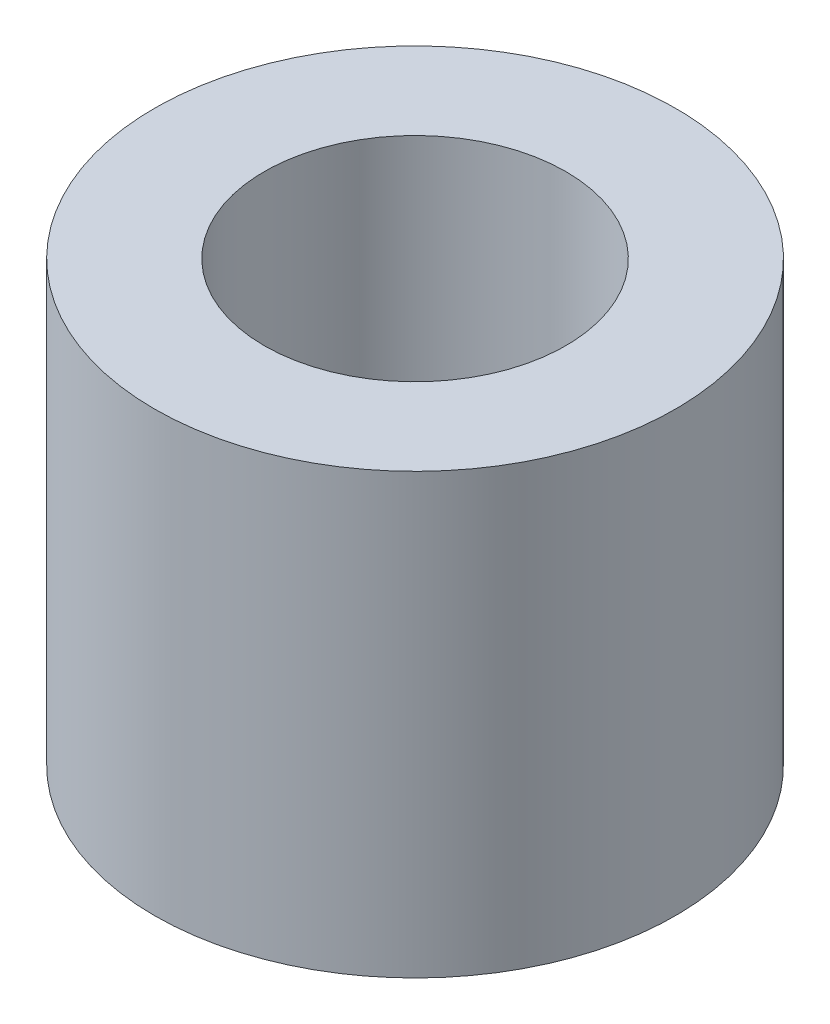
ISO-10303-21;
HEADER;
FILE_DESCRIPTION(('STEP AP214'),'2;1');
FILE_NAME('part.step','',(''),(''),'','','');
FILE_SCHEMA(('AUTOMOTIVE_DESIGN { 1 0 10303 214 1 1 1 1 }'));
ENDSEC;
DATA;
#1=APPLICATION_CONTEXT('core data for automotive mechanical design processes');
#2=APPLICATION_PROTOCOL_DEFINITION('international standard','automotive_design',2000,#1);
#3=PRODUCT_CONTEXT('',#1,'mechanical');
#4=PRODUCT('Part','Part','',(#3));
#5=PRODUCT_RELATED_PRODUCT_CATEGORY('part','',(#4));
#6=PRODUCT_DEFINITION_FORMATION('','',#4);
#7=PRODUCT_DEFINITION_CONTEXT('part definition',#1,'design');
#8=PRODUCT_DEFINITION('design','',#6,#7);
#9=PRODUCT_DEFINITION_SHAPE('','',#8);
#10=(LENGTH_UNIT() NAMED_UNIT(*) SI_UNIT(.MILLI.,.METRE.));
#11=(NAMED_UNIT(*) PLANE_ANGLE_UNIT() SI_UNIT($,.RADIAN.));
#12=(NAMED_UNIT(*) SI_UNIT($,.STERADIAN.) SOLID_ANGLE_UNIT());
#13=UNCERTAINTY_MEASURE_WITH_UNIT(LENGTH_MEASURE(1.E-05),#10,'distance_accuracy_value','');
#14=(GEOMETRIC_REPRESENTATION_CONTEXT(3) GLOBAL_UNCERTAINTY_ASSIGNED_CONTEXT((#13)) GLOBAL_UNIT_ASSIGNED_CONTEXT((#10,
#11,#12)) REPRESENTATION_CONTEXT('',''));
#15=CARTESIAN_POINT('',(0.,0.,0.));
#16=DIRECTION('',(0.,0.,1.));
#17=DIRECTION('',(1.,0.,0.));
#18=AXIS2_PLACEMENT_3D('',#15,#16,#17);
#19=CARTESIAN_POINT('',(0.,16.,0.));
#20=DIRECTION('',(0.,-1.,0.));
#21=DIRECTION('',(0.,0.,-1.));
#22=AXIS2_PLACEMENT_3D('',#19,#20,#21);
#23=CYLINDRICAL_SURFACE('',#22,9.5);
#24=CARTESIAN_POINT('',(0.,16.,0.));
#25=DIRECTION('',(0.,1.,0.));
#26=DIRECTION('',(0.,0.,1.));
#27=AXIS2_PLACEMENT_3D('',#24,#25,#26);
#28=CIRCLE('',#27,9.5);
#29=CARTESIAN_POINT('',(0.,16.,9.5));
#30=VERTEX_POINT('',#29);
#31=EDGE_CURVE('E10',#30,#30,#28,.T.);
#32=ORIENTED_EDGE('',*,*,#31,.F.);
#33=EDGE_LOOP('',(#32));
#34=FACE_BOUND('',#33,.T.);
#35=CARTESIAN_POINT('',(0.,0.,0.));
#36=DIRECTION('',(0.,1.,0.));
#37=DIRECTION('',(0.,0.,1.));
#38=AXIS2_PLACEMENT_3D('',#35,#36,#37);
#39=CIRCLE('',#38,9.5);
#40=CARTESIAN_POINT('',(0.,0.,9.5));
#41=VERTEX_POINT('',#40);
#42=EDGE_CURVE('E34',#41,#41,#39,.T.);
#43=ORIENTED_EDGE('',*,*,#42,.T.);
#44=EDGE_LOOP('',(#43));
#45=FACE_BOUND('',#44,.T.);
#46=ADVANCED_FACE('F31',(#34,#45),#23,.T.);
#47=CARTESIAN_POINT('',(0.,16.,0.));
#48=DIRECTION('',(0.,1.,0.));
#49=DIRECTION('',(0.,0.,1.));
#50=AXIS2_PLACEMENT_3D('',#47,#48,#49);
#51=PLANE('',#50);
#52=CARTESIAN_POINT('',(0.,16.,0.));
#53=DIRECTION('',(0.,1.,0.));
#54=DIRECTION('',(0.,0.,1.));
#55=AXIS2_PLACEMENT_3D('',#52,#53,#54);
#56=CIRCLE('',#55,5.5);
#57=CARTESIAN_POINT('',(0.,16.,5.5));
#58=VERTEX_POINT('',#57);
#59=EDGE_CURVE('E45',#58,#58,#56,.T.);
#60=ORIENTED_EDGE('',*,*,#59,.F.);
#61=EDGE_LOOP('',(#60));
#62=FACE_BOUND('',#61,.T.);
#63=ORIENTED_EDGE('',*,*,#31,.T.);
#64=EDGE_LOOP('',(#63));
#65=FACE_BOUND('',#64,.T.);
#66=ADVANCED_FACE('F52',(#62,#65),#51,.T.);
#67=CARTESIAN_POINT('',(0.,0.,0.));
#68=DIRECTION('',(0.,1.,0.));
#69=DIRECTION('',(0.,0.,1.));
#70=AXIS2_PLACEMENT_3D('',#67,#68,#69);
#71=PLANE('',#70);
#72=CARTESIAN_POINT('',(0.,0.,0.));
#73=DIRECTION('',(0.,1.,0.));
#74=DIRECTION('',(0.,0.,1.));
#75=AXIS2_PLACEMENT_3D('',#72,#73,#74);
#76=CIRCLE('',#75,5.5);
#77=CARTESIAN_POINT('',(0.,0.,5.5));
#78=VERTEX_POINT('',#77);
#79=EDGE_CURVE('E41',#78,#78,#76,.F.);
#80=ORIENTED_EDGE('',*,*,#79,.F.);
#81=EDGE_LOOP('',(#80));
#82=FACE_BOUND('',#81,.T.);
#83=ORIENTED_EDGE('',*,*,#42,.F.);
#84=EDGE_LOOP('',(#83));
#85=FACE_BOUND('',#84,.T.);
#86=ADVANCED_FACE('F54',(#82,#85),#71,.F.);
#87=CARTESIAN_POINT('',(0.,-0.001000000000001,0.));
#88=DIRECTION('',(0.,1.,0.));
#89=DIRECTION('',(0.,0.,1.));
#90=AXIS2_PLACEMENT_3D('',#87,#88,#89);
#91=CYLINDRICAL_SURFACE('',#90,5.5);
#92=ORIENTED_EDGE('',*,*,#59,.T.);
#93=EDGE_LOOP('',(#92));
#94=FACE_BOUND('',#93,.T.);
#95=ORIENTED_EDGE('',*,*,#79,.T.);
#96=EDGE_LOOP('',(#95));
#97=FACE_BOUND('',#96,.T.);
#98=ADVANCED_FACE('F49',(#94,#97),#91,.F.);
#99=CLOSED_SHELL('',(#46,#66,#86,#98));
#100=MANIFOLD_SOLID_BREP('B2',#99);
#101=ADVANCED_BREP_SHAPE_REPRESENTATION('',(#18,#100),#14);
#102=SHAPE_DEFINITION_REPRESENTATION(#9,#101);
ENDSEC;
END-ISO-10303-21;
